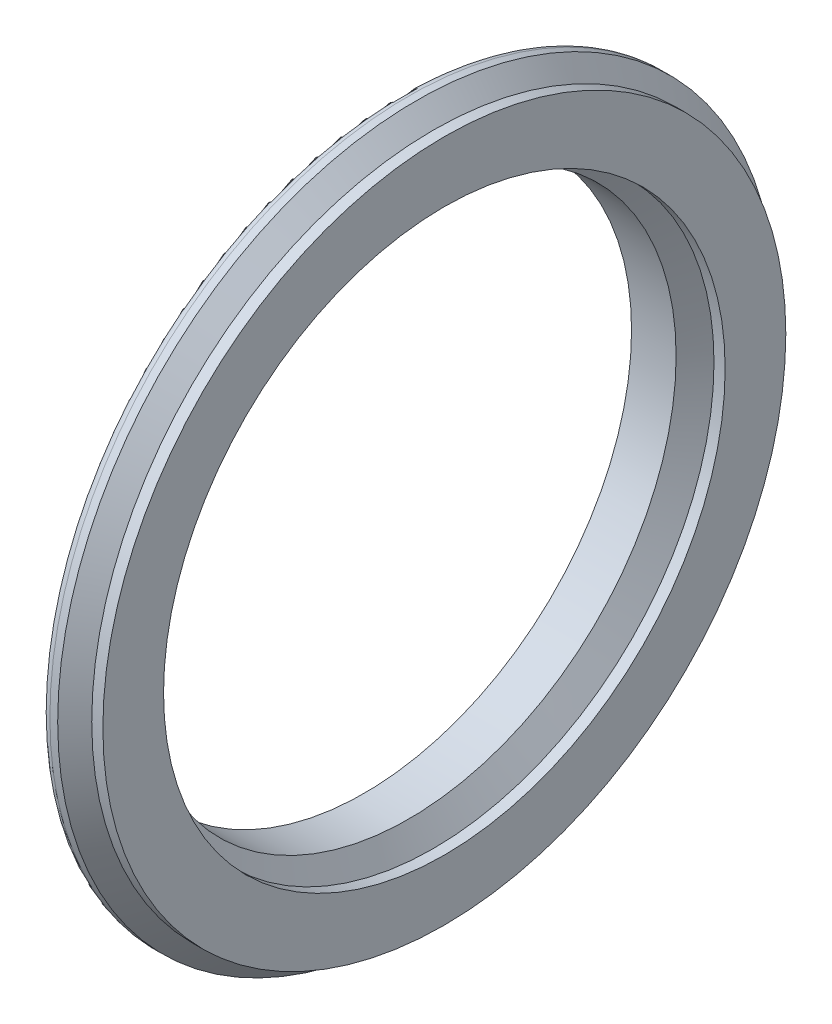
ISO-10303-21;
HEADER;
FILE_DESCRIPTION(('STEP AP214'),'2;1');
FILE_NAME('part.step','',(''),(''),'','','');
FILE_SCHEMA(('AUTOMOTIVE_DESIGN { 1 0 10303 214 1 1 1 1 }'));
ENDSEC;
DATA;
#1=APPLICATION_CONTEXT('core data for automotive mechanical design processes');
#2=APPLICATION_PROTOCOL_DEFINITION('international standard','automotive_design',2000,#1);
#3=PRODUCT_CONTEXT('',#1,'mechanical');
#4=PRODUCT('Part','Part','',(#3));
#5=PRODUCT_RELATED_PRODUCT_CATEGORY('part','',(#4));
#6=PRODUCT_DEFINITION_FORMATION('','',#4);
#7=PRODUCT_DEFINITION_CONTEXT('part definition',#1,'design');
#8=PRODUCT_DEFINITION('design','',#6,#7);
#9=PRODUCT_DEFINITION_SHAPE('','',#8);
#10=(LENGTH_UNIT() NAMED_UNIT(*) SI_UNIT(.MILLI.,.METRE.));
#11=(NAMED_UNIT(*) PLANE_ANGLE_UNIT() SI_UNIT($,.RADIAN.));
#12=(NAMED_UNIT(*) SI_UNIT($,.STERADIAN.) SOLID_ANGLE_UNIT());
#13=UNCERTAINTY_MEASURE_WITH_UNIT(LENGTH_MEASURE(1.E-05),#10,'distance_accuracy_value','');
#14=(GEOMETRIC_REPRESENTATION_CONTEXT(3) GLOBAL_UNCERTAINTY_ASSIGNED_CONTEXT((#13)) GLOBAL_UNIT_ASSIGNED_CONTEXT((#10,
#11,#12)) REPRESENTATION_CONTEXT('',''));
#15=CARTESIAN_POINT('',(0.,0.,0.));
#16=DIRECTION('',(0.,0.,1.));
#17=DIRECTION('',(1.,0.,0.));
#18=AXIS2_PLACEMENT_3D('',#15,#16,#17);
#19=CARTESIAN_POINT('',(-9.,0.,0.));
#20=DIRECTION('',(1.,0.,0.));
#21=DIRECTION('',(0.,0.,-1.));
#22=AXIS2_PLACEMENT_3D('',#19,#20,#21);
#23=CYLINDRICAL_SURFACE('',#22,38.305);
#24=CARTESIAN_POINT('',(-1.25,0.,0.));
#25=DIRECTION('',(1.,0.,0.));
#26=DIRECTION('',(0.,0.,-1.));
#27=AXIS2_PLACEMENT_3D('',#24,#25,#26);
#28=CIRCLE('',#27,38.305);
#29=CARTESIAN_POINT('',(-1.25,0.,-38.305));
#30=VERTEX_POINT('',#29);
#31=EDGE_CURVE('E91',#30,#30,#28,.T.);
#32=ORIENTED_EDGE('',*,*,#31,.T.);
#33=EDGE_LOOP('',(#32));
#34=FACE_BOUND('',#33,.T.);
#35=CARTESIAN_POINT('',(0.,0.,0.));
#36=DIRECTION('',(1.,0.,0.));
#37=DIRECTION('',(0.,0.,-1.));
#38=AXIS2_PLACEMENT_3D('',#35,#36,#37);
#39=CIRCLE('',#38,38.305);
#40=CARTESIAN_POINT('',(0.,0.,-38.305));
#41=VERTEX_POINT('',#40);
#42=EDGE_CURVE('E43',#41,#41,#39,.T.);
#43=ORIENTED_EDGE('',*,*,#42,.F.);
#44=EDGE_LOOP('',(#43));
#45=FACE_BOUND('',#44,.T.);
#46=ADVANCED_FACE('F32',(#34,#45),#23,.T.);
#47=CARTESIAN_POINT('',(0.,31.5,0.));
#48=DIRECTION('',(1.,0.,0.));
#49=DIRECTION('',(0.,0.,-1.));
#50=AXIS2_PLACEMENT_3D('',#47,#48,#49);
#51=PLANE('',#50);
#52=ORIENTED_EDGE('',*,*,#42,.T.);
#53=EDGE_LOOP('',(#52));
#54=FACE_BOUND('',#53,.T.);
#55=CARTESIAN_POINT('',(0.,0.,0.));
#56=DIRECTION('',(1.,0.,0.));
#57=DIRECTION('',(0.,0.,-1.));
#58=AXIS2_PLACEMENT_3D('',#55,#56,#57);
#59=CIRCLE('',#58,31.5);
#60=CARTESIAN_POINT('',(0.,0.,-31.5));
#61=VERTEX_POINT('',#60);
#62=EDGE_CURVE('E47',#61,#61,#59,.T.);
#63=ORIENTED_EDGE('',*,*,#62,.F.);
#64=EDGE_LOOP('',(#63));
#65=FACE_BOUND('',#64,.T.);
#66=ADVANCED_FACE('F110',(#54,#65),#51,.T.);
#67=CARTESIAN_POINT('',(-9.,0.,0.));
#68=DIRECTION('',(1.,0.,0.));
#69=DIRECTION('',(0.,0.,-1.));
#70=AXIS2_PLACEMENT_3D('',#67,#68,#69);
#71=CYLINDRICAL_SURFACE('',#70,31.5);
#72=ORIENTED_EDGE('',*,*,#62,.T.);
#73=EDGE_LOOP('',(#72));
#74=FACE_BOUND('',#73,.T.);
#75=CARTESIAN_POINT('',(-1.25,0.,0.));
#76=DIRECTION('',(1.,0.,0.));
#77=DIRECTION('',(0.,0.,-1.));
#78=AXIS2_PLACEMENT_3D('',#75,#76,#77);
#79=CIRCLE('',#78,31.5);
#80=CARTESIAN_POINT('',(-1.25,0.,-31.5));
#81=VERTEX_POINT('',#80);
#82=EDGE_CURVE('E52',#81,#81,#79,.T.);
#83=ORIENTED_EDGE('',*,*,#82,.F.);
#84=EDGE_LOOP('',(#83));
#85=FACE_BOUND('',#84,.T.);
#86=ADVANCED_FACE('F114',(#74,#85),#71,.F.);
#87=CARTESIAN_POINT('',(-1.25,34.4092589644405,0.));
#88=DIRECTION('',(-1.,0.,0.));
#89=DIRECTION('',(0.,0.,1.));
#90=AXIS2_PLACEMENT_3D('',#87,#88,#89);
#91=PLANE('',#90);
#92=ORIENTED_EDGE('',*,*,#82,.T.);
#93=EDGE_LOOP('',(#92));
#94=FACE_BOUND('',#93,.T.);
#95=CARTESIAN_POINT('',(-1.25,0.,0.));
#96=DIRECTION('',(1.,0.,0.));
#97=DIRECTION('',(0.,0.,-1.));
#98=AXIS2_PLACEMENT_3D('',#95,#96,#97);
#99=CIRCLE('',#98,34.4092589644405);
#100=CARTESIAN_POINT('',(-1.25,0.,-34.4092589644405));
#101=VERTEX_POINT('',#100);
#102=EDGE_CURVE('E55',#101,#101,#99,.T.);
#103=ORIENTED_EDGE('',*,*,#102,.F.);
#104=EDGE_LOOP('',(#103));
#105=FACE_BOUND('',#104,.T.);
#106=ADVANCED_FACE('F120',(#94,#105),#91,.T.);
#107=CARTESIAN_POINT('',(-1.29999999999983,0.,0.));
#108=DIRECTION('',(1.,0.,0.));
#109=DIRECTION('',(0.,0.,-1.));
#110=AXIS2_PLACEMENT_3D('',#107,#108,#109);
#111=TOROIDAL_SURFACE('',#110,34.4092589644405,0.0499999999998295);
#112=ORIENTED_EDGE('',*,*,#102,.T.);
#113=EDGE_LOOP('',(#112));
#114=FACE_BOUND('',#113,.T.);
#115=CARTESIAN_POINT('',(-1.3428911277216,0.,0.));
#116=DIRECTION('',(1.,0.,0.));
#117=DIRECTION('',(0.,0.,-1.));
#118=AXIS2_PLACEMENT_3D('',#115,#116,#117);
#119=CIRCLE('',#118,34.4349562631845);
#120=CARTESIAN_POINT('',(-1.3428911277216,0.,-34.4349562631845));
#121=VERTEX_POINT('',#120);
#122=EDGE_CURVE('E58',#121,#121,#119,.T.);
#123=ORIENTED_EDGE('',*,*,#122,.F.);
#124=EDGE_LOOP('',(#123));
#125=FACE_BOUND('',#124,.T.);
#126=ADVANCED_FACE('F124',(#114,#125),#111,.F.);
#127=CARTESIAN_POINT('',(-4.,0.,0.));
#128=DIRECTION('',(1.,0.,0.));
#129=DIRECTION('',(0.,0.,-1.));
#130=AXIS2_PLACEMENT_3D('',#127,#128,#129);
#131=CONICAL_SURFACE('',#130,30.,1.03101785207752);
#132=ORIENTED_EDGE('',*,*,#122,.T.);
#133=EDGE_LOOP('',(#132));
#134=FACE_BOUND('',#133,.T.);
#135=CARTESIAN_POINT('',(-4.,0.,0.));
#136=DIRECTION('',(1.,0.,0.));
#137=DIRECTION('',(0.,0.,-1.));
#138=AXIS2_PLACEMENT_3D('',#135,#136,#137);
#139=CIRCLE('',#138,30.);
#140=CARTESIAN_POINT('',(-4.,0.,-30.));
#141=VERTEX_POINT('',#140);
#142=EDGE_CURVE('E61',#141,#141,#139,.T.);
#143=ORIENTED_EDGE('',*,*,#142,.F.);
#144=EDGE_LOOP('',(#143));
#145=FACE_BOUND('',#144,.T.);
#146=ADVANCED_FACE('F128',(#134,#145),#131,.F.);
#147=CARTESIAN_POINT('',(-9.,0.,0.));
#148=DIRECTION('',(1.,0.,0.));
#149=DIRECTION('',(0.,0.,-1.));
#150=AXIS2_PLACEMENT_3D('',#147,#148,#149);
#151=CYLINDRICAL_SURFACE('',#150,30.);
#152=ORIENTED_EDGE('',*,*,#142,.T.);
#153=EDGE_LOOP('',(#152));
#154=FACE_BOUND('',#153,.T.);
#155=CARTESIAN_POINT('',(-9.,0.,0.));
#156=DIRECTION('',(1.,0.,0.));
#157=DIRECTION('',(0.,0.,-1.));
#158=AXIS2_PLACEMENT_3D('',#155,#156,#157);
#159=CIRCLE('',#158,30.);
#160=CARTESIAN_POINT('',(-9.,0.,-30.));
#161=VERTEX_POINT('',#160);
#162=EDGE_CURVE('E64',#161,#161,#159,.T.);
#163=ORIENTED_EDGE('',*,*,#162,.F.);
#164=EDGE_LOOP('',(#163));
#165=FACE_BOUND('',#164,.T.);
#166=ADVANCED_FACE('F132',(#154,#165),#151,.F.);
#167=CARTESIAN_POINT('',(-9.,33.18,0.));
#168=DIRECTION('',(-1.,0.,0.));
#169=DIRECTION('',(0.,0.,1.));
#170=AXIS2_PLACEMENT_3D('',#167,#168,#169);
#171=PLANE('',#170);
#172=ORIENTED_EDGE('',*,*,#162,.T.);
#173=EDGE_LOOP('',(#172));
#174=FACE_BOUND('',#173,.T.);
#175=CARTESIAN_POINT('',(-8.99999999999999,0.,0.));
#176=DIRECTION('',(1.,0.,0.));
#177=DIRECTION('',(0.,0.,-1.));
#178=AXIS2_PLACEMENT_3D('',#175,#176,#177);
#179=CIRCLE('',#178,33.18);
#180=CARTESIAN_POINT('',(-8.99999999999999,0.,-33.18));
#181=VERTEX_POINT('',#180);
#182=EDGE_CURVE('E67',#181,#181,#179,.T.);
#183=ORIENTED_EDGE('',*,*,#182,.F.);
#184=EDGE_LOOP('',(#183));
#185=FACE_BOUND('',#184,.T.);
#186=ADVANCED_FACE('F136',(#174,#185),#171,.T.);
#187=CARTESIAN_POINT('',(-9.,0.,0.));
#188=DIRECTION('',(1.,0.,0.));
#189=DIRECTION('',(0.,0.,-1.));
#190=AXIS2_PLACEMENT_3D('',#187,#188,#189);
#191=CYLINDRICAL_SURFACE('',#190,33.18);
#192=ORIENTED_EDGE('',*,*,#182,.T.);
#193=EDGE_LOOP('',(#192));
#194=FACE_BOUND('',#193,.T.);
#195=CARTESIAN_POINT('',(-5.,0.,0.));
#196=DIRECTION('',(1.,0.,0.));
#197=DIRECTION('',(0.,0.,-1.));
#198=AXIS2_PLACEMENT_3D('',#195,#196,#197);
#199=CIRCLE('',#198,33.18);
#200=CARTESIAN_POINT('',(-5.,0.,-33.18));
#201=VERTEX_POINT('',#200);
#202=EDGE_CURVE('E70',#201,#201,#199,.T.);
#203=ORIENTED_EDGE('',*,*,#202,.F.);
#204=EDGE_LOOP('',(#203));
#205=FACE_BOUND('',#204,.T.);
#206=ADVANCED_FACE('F140',(#194,#205),#191,.T.);
#207=CARTESIAN_POINT('',(-4.6609385327165,0.,0.));
#208=DIRECTION('',(-1.,0.,0.));
#209=DIRECTION('',(0.,0.,1.));
#210=AXIS2_PLACEMENT_3D('',#207,#208,#209);
#211=CONICAL_SURFACE('',#210,32.101784534038,1.26612191129674);
#212=ORIENTED_EDGE('',*,*,#202,.T.);
#213=EDGE_LOOP('',(#212));
#214=FACE_BOUND('',#213,.T.);
#215=CARTESIAN_POINT('',(-4.6609385327165,0.,0.));
#216=DIRECTION('',(1.,0.,0.));
#217=DIRECTION('',(0.,0.,-1.));
#218=AXIS2_PLACEMENT_3D('',#215,#216,#217);
#219=CIRCLE('',#218,32.101784534038);
#220=CARTESIAN_POINT('',(-4.6609385327165,0.,-32.101784534038));
#221=VERTEX_POINT('',#220);
#222=EDGE_CURVE('E73',#221,#221,#219,.T.);
#223=ORIENTED_EDGE('',*,*,#222,.F.);
#224=EDGE_LOOP('',(#223));
#225=FACE_BOUND('',#224,.T.);
#226=ADVANCED_FACE('F144',(#214,#225),#211,.T.);
#227=CARTESIAN_POINT('',(-2.48375,0.,0.));
#228=DIRECTION('',(1.,0.,0.));
#229=DIRECTION('',(0.,0.,-1.));
#230=AXIS2_PLACEMENT_3D('',#227,#228,#229);
#231=CONICAL_SURFACE('',#230,34.59,0.851966327173329);
#232=ORIENTED_EDGE('',*,*,#222,.T.);
#233=EDGE_LOOP('',(#232));
#234=FACE_BOUND('',#233,.T.);
#235=CARTESIAN_POINT('',(-2.48375,0.,0.));
#236=DIRECTION('',(1.,0.,0.));
#237=DIRECTION('',(0.,0.,-1.));
#238=AXIS2_PLACEMENT_3D('',#235,#236,#237);
#239=CIRCLE('',#238,34.59);
#240=CARTESIAN_POINT('',(-2.48375,0.,-34.59));
#241=VERTEX_POINT('',#240);
#242=EDGE_CURVE('E76',#241,#241,#239,.T.);
#243=ORIENTED_EDGE('',*,*,#242,.F.);
#244=EDGE_LOOP('',(#243));
#245=FACE_BOUND('',#244,.T.);
#246=ADVANCED_FACE('F148',(#234,#245),#231,.T.);
#247=CARTESIAN_POINT('',(-9.,0.,0.));
#248=DIRECTION('',(1.,0.,0.));
#249=DIRECTION('',(0.,0.,-1.));
#250=AXIS2_PLACEMENT_3D('',#247,#248,#249);
#251=CYLINDRICAL_SURFACE('',#250,34.59);
#252=ORIENTED_EDGE('',*,*,#242,.T.);
#253=EDGE_LOOP('',(#252));
#254=FACE_BOUND('',#253,.T.);
#255=CARTESIAN_POINT('',(-1.25,0.,0.));
#256=DIRECTION('',(1.,0.,0.));
#257=DIRECTION('',(0.,0.,-1.));
#258=AXIS2_PLACEMENT_3D('',#255,#256,#257);
#259=CIRCLE('',#258,34.59);
#260=CARTESIAN_POINT('',(-1.25,0.,-34.59));
#261=VERTEX_POINT('',#260);
#262=EDGE_CURVE('E79',#261,#261,#259,.T.);
#263=ORIENTED_EDGE('',*,*,#262,.F.);
#264=EDGE_LOOP('',(#263));
#265=FACE_BOUND('',#264,.T.);
#266=ADVANCED_FACE('F152',(#254,#265),#251,.T.);
#267=CARTESIAN_POINT('',(-1.25,36.,0.));
#268=DIRECTION('',(-1.,0.,0.));
#269=DIRECTION('',(0.,0.,1.));
#270=AXIS2_PLACEMENT_3D('',#267,#268,#269);
#271=PLANE('',#270);
#272=ORIENTED_EDGE('',*,*,#262,.T.);
#273=EDGE_LOOP('',(#272));
#274=FACE_BOUND('',#273,.T.);
#275=CARTESIAN_POINT('',(-1.25,0.,0.));
#276=DIRECTION('',(1.,0.,0.));
#277=DIRECTION('',(0.,0.,-1.));
#278=AXIS2_PLACEMENT_3D('',#275,#276,#277);
#279=CIRCLE('',#278,36.);
#280=CARTESIAN_POINT('',(-1.25,0.,-36.));
#281=VERTEX_POINT('',#280);
#282=EDGE_CURVE('E82',#281,#281,#279,.T.);
#283=ORIENTED_EDGE('',*,*,#282,.F.);
#284=EDGE_LOOP('',(#283));
#285=FACE_BOUND('',#284,.T.);
#286=ADVANCED_FACE('F156',(#274,#285),#271,.T.);
#287=CARTESIAN_POINT('',(-9.,0.,0.));
#288=DIRECTION('',(1.,0.,0.));
#289=DIRECTION('',(0.,0.,-1.));
#290=AXIS2_PLACEMENT_3D('',#287,#288,#289);
#291=CYLINDRICAL_SURFACE('',#290,36.);
#292=ORIENTED_EDGE('',*,*,#282,.T.);
#293=EDGE_LOOP('',(#292));
#294=FACE_BOUND('',#293,.T.);
#295=CARTESIAN_POINT('',(-5.,0.,0.));
#296=DIRECTION('',(1.,0.,0.));
#297=DIRECTION('',(0.,0.,-1.));
#298=AXIS2_PLACEMENT_3D('',#295,#296,#297);
#299=CIRCLE('',#298,36.);
#300=CARTESIAN_POINT('',(-5.,0.,-36.));
#301=VERTEX_POINT('',#300);
#302=EDGE_CURVE('E85',#301,#301,#299,.T.);
#303=ORIENTED_EDGE('',*,*,#302,.F.);
#304=EDGE_LOOP('',(#303));
#305=FACE_BOUND('',#304,.T.);
#306=ADVANCED_FACE('F160',(#294,#305),#291,.F.);
#307=CARTESIAN_POINT('',(-5.,40.25,0.));
#308=DIRECTION('',(-1.,0.,0.));
#309=DIRECTION('',(0.,0.,1.));
#310=AXIS2_PLACEMENT_3D('',#307,#308,#309);
#311=PLANE('',#310);
#312=CARTESIAN_POINT('',(-5.,0.,0.));
#313=DIRECTION('',(-1.,0.,0.));
#314=DIRECTION('',(0.,0.,1.));
#315=AXIS2_PLACEMENT_3D('',#312,#313,#314);
#316=CIRCLE('',#315,39.2500000000007);
#317=CARTESIAN_POINT('',(-5.,0.,39.2500000000007));
#318=VERTEX_POINT('',#317);
#319=EDGE_CURVE('E10',#318,#318,#316,.T.);
#320=ORIENTED_EDGE('',*,*,#319,.T.);
#321=EDGE_LOOP('',(#320));
#322=FACE_BOUND('',#321,.T.);
#323=ORIENTED_EDGE('',*,*,#302,.T.);
#324=EDGE_LOOP('',(#323));
#325=FACE_BOUND('',#324,.T.);
#326=ADVANCED_FACE('F107',(#322,#325),#311,.T.);
#327=CARTESIAN_POINT('',(-9.,0.,0.));
#328=DIRECTION('',(1.,0.,0.));
#329=DIRECTION('',(0.,0.,-1.));
#330=AXIS2_PLACEMENT_3D('',#327,#328,#329);
#331=CYLINDRICAL_SURFACE('',#330,40.25);
#332=CARTESIAN_POINT('',(-4.0000000000007,0.,0.));
#333=DIRECTION('',(-1.,0.,0.));
#334=DIRECTION('',(0.,0.,1.));
#335=AXIS2_PLACEMENT_3D('',#332,#333,#334);
#336=CIRCLE('',#335,40.25);
#337=CARTESIAN_POINT('',(-4.0000000000007,0.,40.25));
#338=VERTEX_POINT('',#337);
#339=EDGE_CURVE('E39',#338,#338,#336,.F.);
#340=ORIENTED_EDGE('',*,*,#339,.T.);
#341=EDGE_LOOP('',(#340));
#342=FACE_BOUND('',#341,.T.);
#343=CARTESIAN_POINT('',(-3.125,0.,0.));
#344=DIRECTION('',(1.,0.,0.));
#345=DIRECTION('',(0.,0.,-1.));
#346=AXIS2_PLACEMENT_3D('',#343,#344,#345);
#347=CIRCLE('',#346,40.25);
#348=CARTESIAN_POINT('',(-3.125,0.,-40.25));
#349=VERTEX_POINT('',#348);
#350=EDGE_CURVE('E88',#349,#349,#347,.T.);
#351=ORIENTED_EDGE('',*,*,#350,.F.);
#352=EDGE_LOOP('',(#351));
#353=FACE_BOUND('',#352,.T.);
#354=ADVANCED_FACE('F99',(#342,#353),#331,.T.);
#355=CARTESIAN_POINT('',(-1.25,0.,0.));
#356=DIRECTION('',(-1.,0.,0.));
#357=DIRECTION('',(0.,0.,1.));
#358=AXIS2_PLACEMENT_3D('',#355,#356,#357);
#359=CONICAL_SURFACE('',#358,38.305,0.803720720059599);
#360=ORIENTED_EDGE('',*,*,#350,.T.);
#361=EDGE_LOOP('',(#360));
#362=FACE_BOUND('',#361,.T.);
#363=ORIENTED_EDGE('',*,*,#31,.F.);
#364=EDGE_LOOP('',(#363));
#365=FACE_BOUND('',#364,.T.);
#366=ADVANCED_FACE('F97',(#362,#365),#359,.T.);
#367=CARTESIAN_POINT('',(-4.0000000000007,0.,0.));
#368=DIRECTION('',(-1.,0.,0.));
#369=DIRECTION('',(0.,0.,1.));
#370=AXIS2_PLACEMENT_3D('',#367,#368,#369);
#371=TOROIDAL_SURFACE('',#370,39.2500000000007,0.9999999999993);
#372=ORIENTED_EDGE('',*,*,#319,.F.);
#373=EDGE_LOOP('',(#372));
#374=FACE_BOUND('',#373,.T.);
#375=ORIENTED_EDGE('',*,*,#339,.F.);
#376=EDGE_LOOP('',(#375));
#377=FACE_BOUND('',#376,.T.);
#378=ADVANCED_FACE('F34',(#374,#377),#371,.T.);
#379=CLOSED_SHELL('',(#46,#66,#86,#106,#126,#146,#166,#186,#206,#226,#246,#266,#286,#306,#326,
#354,#366,#378));
#380=MANIFOLD_SOLID_BREP('B2',#379);
#381=ADVANCED_BREP_SHAPE_REPRESENTATION('',(#18,#380),#14);
#382=SHAPE_DEFINITION_REPRESENTATION(#9,#381);
ENDSEC;
END-ISO-10303-21;
